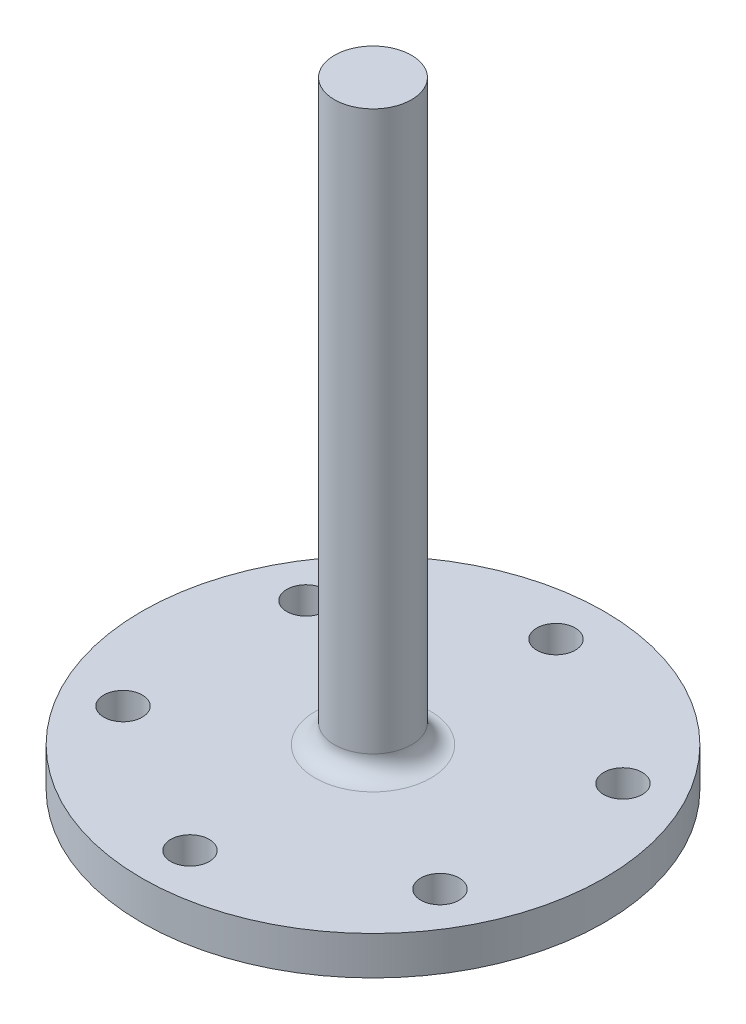
ISO-10303-21;
HEADER;
FILE_DESCRIPTION(('STEP AP214'),'2;1');
FILE_NAME('part.step','',(''),(''),'','','');
FILE_SCHEMA(('AUTOMOTIVE_DESIGN { 1 0 10303 214 1 1 1 1 }'));
ENDSEC;
DATA;
#1=APPLICATION_CONTEXT('core data for automotive mechanical design processes');
#2=APPLICATION_PROTOCOL_DEFINITION('international standard','automotive_design',2000,#1);
#3=PRODUCT_CONTEXT('',#1,'mechanical');
#4=PRODUCT('Part','Part','',(#3));
#5=PRODUCT_RELATED_PRODUCT_CATEGORY('part','',(#4));
#6=PRODUCT_DEFINITION_FORMATION('','',#4);
#7=PRODUCT_DEFINITION_CONTEXT('part definition',#1,'design');
#8=PRODUCT_DEFINITION('design','',#6,#7);
#9=PRODUCT_DEFINITION_SHAPE('','',#8);
#10=(LENGTH_UNIT() NAMED_UNIT(*) SI_UNIT(.MILLI.,.METRE.));
#11=(NAMED_UNIT(*) PLANE_ANGLE_UNIT() SI_UNIT($,.RADIAN.));
#12=(NAMED_UNIT(*) SI_UNIT($,.STERADIAN.) SOLID_ANGLE_UNIT());
#13=UNCERTAINTY_MEASURE_WITH_UNIT(LENGTH_MEASURE(1.E-05),#10,'distance_accuracy_value','');
#14=(GEOMETRIC_REPRESENTATION_CONTEXT(3) GLOBAL_UNCERTAINTY_ASSIGNED_CONTEXT((#13)) GLOBAL_UNIT_ASSIGNED_CONTEXT((#10,
#11,#12)) REPRESENTATION_CONTEXT('',''));
#15=CARTESIAN_POINT('',(0.,0.,0.));
#16=DIRECTION('',(0.,0.,1.));
#17=DIRECTION('',(1.,0.,0.));
#18=AXIS2_PLACEMENT_3D('',#15,#16,#17);
#19=CARTESIAN_POINT('',(0.,5.,0.));
#20=DIRECTION('',(0.,1.,0.));
#21=DIRECTION('',(0.,0.,1.));
#22=AXIS2_PLACEMENT_3D('',#19,#20,#21);
#23=PLANE('',#22);
#24=CARTESIAN_POINT('',(0.,5.,0.));
#25=DIRECTION('',(0.,1.,0.));
#26=DIRECTION('',(0.,0.,1.));
#27=AXIS2_PLACEMENT_3D('',#24,#25,#26);
#28=CIRCLE('',#27,7.5);
#29=CARTESIAN_POINT('',(0.,5.,7.5));
#30=VERTEX_POINT('',#29);
#31=EDGE_CURVE('E11',#30,#30,#28,.F.);
#32=ORIENTED_EDGE('',*,*,#31,.T.);
#33=EDGE_LOOP('',(#32));
#34=FACE_BOUND('',#33,.T.);
#35=CARTESIAN_POINT('',(-20.5681033398805,5.,11.8749999999999));
#36=DIRECTION('',(0.,1.,0.));
#37=DIRECTION('',(0.,0.,1.));
#38=AXIS2_PLACEMENT_3D('',#35,#36,#37);
#39=CIRCLE('',#38,2.5);
#40=CARTESIAN_POINT('',(-20.5681033398805,5.,14.3749999999999));
#41=VERTEX_POINT('',#40);
#42=EDGE_CURVE('E109',#41,#41,#39,.T.);
#43=ORIENTED_EDGE('',*,*,#42,.F.);
#44=EDGE_LOOP('',(#43));
#45=FACE_BOUND('',#44,.T.);
#46=CARTESIAN_POINT('',(0.,5.,-23.75));
#47=DIRECTION('',(0.,1.,0.));
#48=DIRECTION('',(0.,0.,1.));
#49=AXIS2_PLACEMENT_3D('',#46,#47,#48);
#50=CIRCLE('',#49,2.5);
#51=CARTESIAN_POINT('',(0.,5.,-21.25));
#52=VERTEX_POINT('',#51);
#53=EDGE_CURVE('E97',#52,#52,#50,.T.);
#54=ORIENTED_EDGE('',*,*,#53,.F.);
#55=EDGE_LOOP('',(#54));
#56=FACE_BOUND('',#55,.T.);
#57=CARTESIAN_POINT('',(20.5681033398804,5.,11.875));
#58=DIRECTION('',(0.,1.,0.));
#59=DIRECTION('',(0.,0.,1.));
#60=AXIS2_PLACEMENT_3D('',#57,#58,#59);
#61=CIRCLE('',#60,2.5);
#62=CARTESIAN_POINT('',(20.5681033398804,5.,14.375));
#63=VERTEX_POINT('',#62);
#64=EDGE_CURVE('E86',#63,#63,#61,.T.);
#65=ORIENTED_EDGE('',*,*,#64,.F.);
#66=EDGE_LOOP('',(#65));
#67=FACE_BOUND('',#66,.T.);
#68=CARTESIAN_POINT('',(0.,5.,0.));
#69=DIRECTION('',(0.,1.,0.));
#70=DIRECTION('',(0.,0.,1.));
#71=AXIS2_PLACEMENT_3D('',#68,#69,#70);
#72=CIRCLE('',#71,30.);
#73=CARTESIAN_POINT('',(0.,5.,30.));
#74=VERTEX_POINT('',#73);
#75=EDGE_CURVE('E78',#74,#74,#72,.T.);
#76=ORIENTED_EDGE('',*,*,#75,.T.);
#77=EDGE_LOOP('',(#76));
#78=FACE_BOUND('',#77,.T.);
#79=CARTESIAN_POINT('',(20.5681033398804,5.,-11.875));
#80=DIRECTION('',(0.,1.,0.));
#81=DIRECTION('',(0.,0.,1.));
#82=AXIS2_PLACEMENT_3D('',#79,#80,#81);
#83=CIRCLE('',#82,2.5);
#84=CARTESIAN_POINT('',(20.5681033398804,5.,-9.37500000000003));
#85=VERTEX_POINT('',#84);
#86=EDGE_CURVE('E91',#85,#85,#83,.T.);
#87=ORIENTED_EDGE('',*,*,#86,.F.);
#88=EDGE_LOOP('',(#87));
#89=FACE_BOUND('',#88,.T.);
#90=CARTESIAN_POINT('',(-20.5681033398805,5.,-11.8749999999999));
#91=DIRECTION('',(0.,1.,0.));
#92=DIRECTION('',(0.,0.,1.));
#93=AXIS2_PLACEMENT_3D('',#90,#91,#92);
#94=CIRCLE('',#93,2.5);
#95=CARTESIAN_POINT('',(-20.5681033398805,5.,-9.37499999999988));
#96=VERTEX_POINT('',#95);
#97=EDGE_CURVE('E103',#96,#96,#94,.T.);
#98=ORIENTED_EDGE('',*,*,#97,.F.);
#99=EDGE_LOOP('',(#98));
#100=FACE_BOUND('',#99,.T.);
#101=CARTESIAN_POINT('',(0.,5.,23.75));
#102=DIRECTION('',(0.,1.,0.));
#103=DIRECTION('',(0.,0.,1.));
#104=AXIS2_PLACEMENT_3D('',#101,#102,#103);
#105=CIRCLE('',#104,2.5);
#106=CARTESIAN_POINT('',(0.,5.,26.25));
#107=VERTEX_POINT('',#106);
#108=EDGE_CURVE('E115',#107,#107,#105,.T.);
#109=ORIENTED_EDGE('',*,*,#108,.F.);
#110=EDGE_LOOP('',(#109));
#111=FACE_BOUND('',#110,.T.);
#112=ADVANCED_FACE('F67',(#34,#45,#56,#67,#78,#89,#100,#111),#23,.T.);
#113=CARTESIAN_POINT('',(0.,0.,0.));
#114=DIRECTION('',(0.,1.,0.));
#115=DIRECTION('',(0.,0.,1.));
#116=AXIS2_PLACEMENT_3D('',#113,#114,#115);
#117=PLANE('',#116);
#118=CARTESIAN_POINT('',(0.,0.,0.));
#119=DIRECTION('',(0.,1.,0.));
#120=DIRECTION('',(0.,0.,1.));
#121=AXIS2_PLACEMENT_3D('',#118,#119,#120);
#122=CIRCLE('',#121,30.);
#123=CARTESIAN_POINT('',(0.,0.,30.));
#124=VERTEX_POINT('',#123);
#125=EDGE_CURVE('E82',#124,#124,#122,.T.);
#126=ORIENTED_EDGE('',*,*,#125,.F.);
#127=EDGE_LOOP('',(#126));
#128=FACE_BOUND('',#127,.T.);
#129=CARTESIAN_POINT('',(20.5681033398804,0.,11.875));
#130=DIRECTION('',(0.,1.,0.));
#131=DIRECTION('',(0.,0.,1.));
#132=AXIS2_PLACEMENT_3D('',#129,#130,#131);
#133=CIRCLE('',#132,2.5);
#134=CARTESIAN_POINT('',(20.5681033398804,0.,14.375));
#135=VERTEX_POINT('',#134);
#136=EDGE_CURVE('E88',#135,#135,#133,.T.);
#137=ORIENTED_EDGE('',*,*,#136,.T.);
#138=EDGE_LOOP('',(#137));
#139=FACE_BOUND('',#138,.T.);
#140=CARTESIAN_POINT('',(20.5681033398804,0.,-11.875));
#141=DIRECTION('',(0.,1.,0.));
#142=DIRECTION('',(0.,0.,1.));
#143=AXIS2_PLACEMENT_3D('',#140,#141,#142);
#144=CIRCLE('',#143,2.5);
#145=CARTESIAN_POINT('',(20.5681033398804,0.,-9.37500000000003));
#146=VERTEX_POINT('',#145);
#147=EDGE_CURVE('E94',#146,#146,#144,.T.);
#148=ORIENTED_EDGE('',*,*,#147,.T.);
#149=EDGE_LOOP('',(#148));
#150=FACE_BOUND('',#149,.T.);
#151=CARTESIAN_POINT('',(0.,0.,-23.75));
#152=DIRECTION('',(0.,1.,0.));
#153=DIRECTION('',(0.,0.,1.));
#154=AXIS2_PLACEMENT_3D('',#151,#152,#153);
#155=CIRCLE('',#154,2.5);
#156=CARTESIAN_POINT('',(0.,0.,-21.25));
#157=VERTEX_POINT('',#156);
#158=EDGE_CURVE('E100',#157,#157,#155,.T.);
#159=ORIENTED_EDGE('',*,*,#158,.T.);
#160=EDGE_LOOP('',(#159));
#161=FACE_BOUND('',#160,.T.);
#162=CARTESIAN_POINT('',(-20.5681033398805,0.,-11.8749999999999));
#163=DIRECTION('',(0.,1.,0.));
#164=DIRECTION('',(0.,0.,1.));
#165=AXIS2_PLACEMENT_3D('',#162,#163,#164);
#166=CIRCLE('',#165,2.5);
#167=CARTESIAN_POINT('',(-20.5681033398805,0.,-9.37499999999988));
#168=VERTEX_POINT('',#167);
#169=EDGE_CURVE('E106',#168,#168,#166,.T.);
#170=ORIENTED_EDGE('',*,*,#169,.T.);
#171=EDGE_LOOP('',(#170));
#172=FACE_BOUND('',#171,.T.);
#173=CARTESIAN_POINT('',(-20.5681033398805,0.,11.8749999999999));
#174=DIRECTION('',(0.,1.,0.));
#175=DIRECTION('',(0.,0.,1.));
#176=AXIS2_PLACEMENT_3D('',#173,#174,#175);
#177=CIRCLE('',#176,2.5);
#178=CARTESIAN_POINT('',(-20.5681033398805,0.,14.3749999999999));
#179=VERTEX_POINT('',#178);
#180=EDGE_CURVE('E112',#179,#179,#177,.T.);
#181=ORIENTED_EDGE('',*,*,#180,.T.);
#182=EDGE_LOOP('',(#181));
#183=FACE_BOUND('',#182,.T.);
#184=CARTESIAN_POINT('',(0.,0.,23.75));
#185=DIRECTION('',(0.,1.,0.));
#186=DIRECTION('',(0.,0.,1.));
#187=AXIS2_PLACEMENT_3D('',#184,#185,#186);
#188=CIRCLE('',#187,2.5);
#189=CARTESIAN_POINT('',(0.,0.,26.25));
#190=VERTEX_POINT('',#189);
#191=EDGE_CURVE('E118',#190,#190,#188,.T.);
#192=ORIENTED_EDGE('',*,*,#191,.T.);
#193=EDGE_LOOP('',(#192));
#194=FACE_BOUND('',#193,.T.);
#195=ADVANCED_FACE('F142',(#128,#139,#150,#161,#172,#183,#194),#117,.F.);
#196=CARTESIAN_POINT('',(0.,5.,0.));
#197=DIRECTION('',(0.,-1.,0.));
#198=DIRECTION('',(0.,0.,-1.));
#199=AXIS2_PLACEMENT_3D('',#196,#197,#198);
#200=CYLINDRICAL_SURFACE('',#199,30.);
#201=ORIENTED_EDGE('',*,*,#75,.F.);
#202=EDGE_LOOP('',(#201));
#203=FACE_BOUND('',#202,.T.);
#204=ORIENTED_EDGE('',*,*,#125,.T.);
#205=EDGE_LOOP('',(#204));
#206=FACE_BOUND('',#205,.T.);
#207=ADVANCED_FACE('F147',(#203,#206),#200,.T.);
#208=CARTESIAN_POINT('',(20.5681033398804,5.,11.875));
#209=DIRECTION('',(0.,-1.,0.));
#210=DIRECTION('',(0.,0.,-1.));
#211=AXIS2_PLACEMENT_3D('',#208,#209,#210);
#212=CYLINDRICAL_SURFACE('',#211,2.5);
#213=ORIENTED_EDGE('',*,*,#64,.T.);
#214=EDGE_LOOP('',(#213));
#215=FACE_BOUND('',#214,.T.);
#216=ORIENTED_EDGE('',*,*,#136,.F.);
#217=EDGE_LOOP('',(#216));
#218=FACE_BOUND('',#217,.T.);
#219=ADVANCED_FACE('F152',(#215,#218),#212,.F.);
#220=CARTESIAN_POINT('',(20.5681033398804,5.,-11.875));
#221=DIRECTION('',(0.,-1.,0.));
#222=DIRECTION('',(0.,0.,-1.));
#223=AXIS2_PLACEMENT_3D('',#220,#221,#222);
#224=CYLINDRICAL_SURFACE('',#223,2.5);
#225=ORIENTED_EDGE('',*,*,#86,.T.);
#226=EDGE_LOOP('',(#225));
#227=FACE_BOUND('',#226,.T.);
#228=ORIENTED_EDGE('',*,*,#147,.F.);
#229=EDGE_LOOP('',(#228));
#230=FACE_BOUND('',#229,.T.);
#231=ADVANCED_FACE('F159',(#227,#230),#224,.F.);
#232=CARTESIAN_POINT('',(0.,5.,-23.75));
#233=DIRECTION('',(0.,-1.,0.));
#234=DIRECTION('',(0.,0.,-1.));
#235=AXIS2_PLACEMENT_3D('',#232,#233,#234);
#236=CYLINDRICAL_SURFACE('',#235,2.5);
#237=ORIENTED_EDGE('',*,*,#53,.T.);
#238=EDGE_LOOP('',(#237));
#239=FACE_BOUND('',#238,.T.);
#240=ORIENTED_EDGE('',*,*,#158,.F.);
#241=EDGE_LOOP('',(#240));
#242=FACE_BOUND('',#241,.T.);
#243=ADVANCED_FACE('F185',(#239,#242),#236,.F.);
#244=CARTESIAN_POINT('',(-20.5681033398805,5.,-11.8749999999999));
#245=DIRECTION('',(0.,-1.,0.));
#246=DIRECTION('',(0.,0.,-1.));
#247=AXIS2_PLACEMENT_3D('',#244,#245,#246);
#248=CYLINDRICAL_SURFACE('',#247,2.5);
#249=ORIENTED_EDGE('',*,*,#97,.T.);
#250=EDGE_LOOP('',(#249));
#251=FACE_BOUND('',#250,.T.);
#252=ORIENTED_EDGE('',*,*,#169,.F.);
#253=EDGE_LOOP('',(#252));
#254=FACE_BOUND('',#253,.T.);
#255=ADVANCED_FACE('F179',(#251,#254),#248,.F.);
#256=CARTESIAN_POINT('',(-20.5681033398805,5.,11.8749999999999));
#257=DIRECTION('',(0.,-1.,0.));
#258=DIRECTION('',(0.,0.,-1.));
#259=AXIS2_PLACEMENT_3D('',#256,#257,#258);
#260=CYLINDRICAL_SURFACE('',#259,2.5);
#261=ORIENTED_EDGE('',*,*,#42,.T.);
#262=EDGE_LOOP('',(#261));
#263=FACE_BOUND('',#262,.T.);
#264=ORIENTED_EDGE('',*,*,#180,.F.);
#265=EDGE_LOOP('',(#264));
#266=FACE_BOUND('',#265,.T.);
#267=ADVANCED_FACE('F138',(#263,#266),#260,.F.);
#268=CARTESIAN_POINT('',(0.,5.,23.75));
#269=DIRECTION('',(0.,-1.,0.));
#270=DIRECTION('',(0.,0.,-1.));
#271=AXIS2_PLACEMENT_3D('',#268,#269,#270);
#272=CYLINDRICAL_SURFACE('',#271,2.5);
#273=ORIENTED_EDGE('',*,*,#108,.T.);
#274=EDGE_LOOP('',(#273));
#275=FACE_BOUND('',#274,.T.);
#276=ORIENTED_EDGE('',*,*,#191,.F.);
#277=EDGE_LOOP('',(#276));
#278=FACE_BOUND('',#277,.T.);
#279=ADVANCED_FACE('F131',(#275,#278),#272,.F.);
#280=CARTESIAN_POINT('',(0.,80.,0.));
#281=DIRECTION('',(0.,-1.,0.));
#282=DIRECTION('',(0.,0.,-1.));
#283=AXIS2_PLACEMENT_3D('',#280,#281,#282);
#284=CYLINDRICAL_SURFACE('',#283,5.);
#285=CARTESIAN_POINT('',(0.,7.49999999999999,0.));
#286=DIRECTION('',(0.,1.,0.));
#287=DIRECTION('',(0.,0.,1.));
#288=AXIS2_PLACEMENT_3D('',#285,#286,#287);
#289=CIRCLE('',#288,5.);
#290=CARTESIAN_POINT('',(0.,7.49999999999999,5.));
#291=VERTEX_POINT('',#290);
#292=EDGE_CURVE('E74',#291,#291,#289,.T.);
#293=ORIENTED_EDGE('',*,*,#292,.T.);
#294=EDGE_LOOP('',(#293));
#295=FACE_BOUND('',#294,.T.);
#296=CARTESIAN_POINT('',(0.,80.,0.));
#297=DIRECTION('',(0.,1.,0.));
#298=DIRECTION('',(0.,0.,1.));
#299=AXIS2_PLACEMENT_3D('',#296,#297,#298);
#300=CIRCLE('',#299,5.);
#301=CARTESIAN_POINT('',(0.,80.,5.));
#302=VERTEX_POINT('',#301);
#303=EDGE_CURVE('E121',#302,#302,#300,.T.);
#304=ORIENTED_EDGE('',*,*,#303,.F.);
#305=EDGE_LOOP('',(#304));
#306=FACE_BOUND('',#305,.T.);
#307=ADVANCED_FACE('F129',(#295,#306),#284,.T.);
#308=CARTESIAN_POINT('',(0.,80.,0.));
#309=DIRECTION('',(0.,1.,0.));
#310=DIRECTION('',(0.,0.,1.));
#311=AXIS2_PLACEMENT_3D('',#308,#309,#310);
#312=PLANE('',#311);
#313=ORIENTED_EDGE('',*,*,#303,.T.);
#314=EDGE_LOOP('',(#313));
#315=FACE_BOUND('',#314,.T.);
#316=ADVANCED_FACE('F127',(#315),#312,.T.);
#317=CARTESIAN_POINT('',(0.,7.49999999999999,0.));
#318=DIRECTION('',(0.,1.,0.));
#319=DIRECTION('',(0.,0.,1.));
#320=AXIS2_PLACEMENT_3D('',#317,#318,#319);
#321=TOROIDAL_SURFACE('',#320,7.5,2.5);
#322=ORIENTED_EDGE('',*,*,#31,.F.);
#323=EDGE_LOOP('',(#322));
#324=FACE_BOUND('',#323,.T.);
#325=ORIENTED_EDGE('',*,*,#292,.F.);
#326=EDGE_LOOP('',(#325));
#327=FACE_BOUND('',#326,.T.);
#328=ADVANCED_FACE('F69',(#324,#327),#321,.F.);
#329=CLOSED_SHELL('',(#112,#195,#207,#219,#231,#243,#255,#267,#279,#307,#316,#328));
#330=MANIFOLD_SOLID_BREP('B2',#329);
#331=ADVANCED_BREP_SHAPE_REPRESENTATION('',(#18,#330),#14);
#332=SHAPE_DEFINITION_REPRESENTATION(#9,#331);
ENDSEC;
END-ISO-10303-21;
